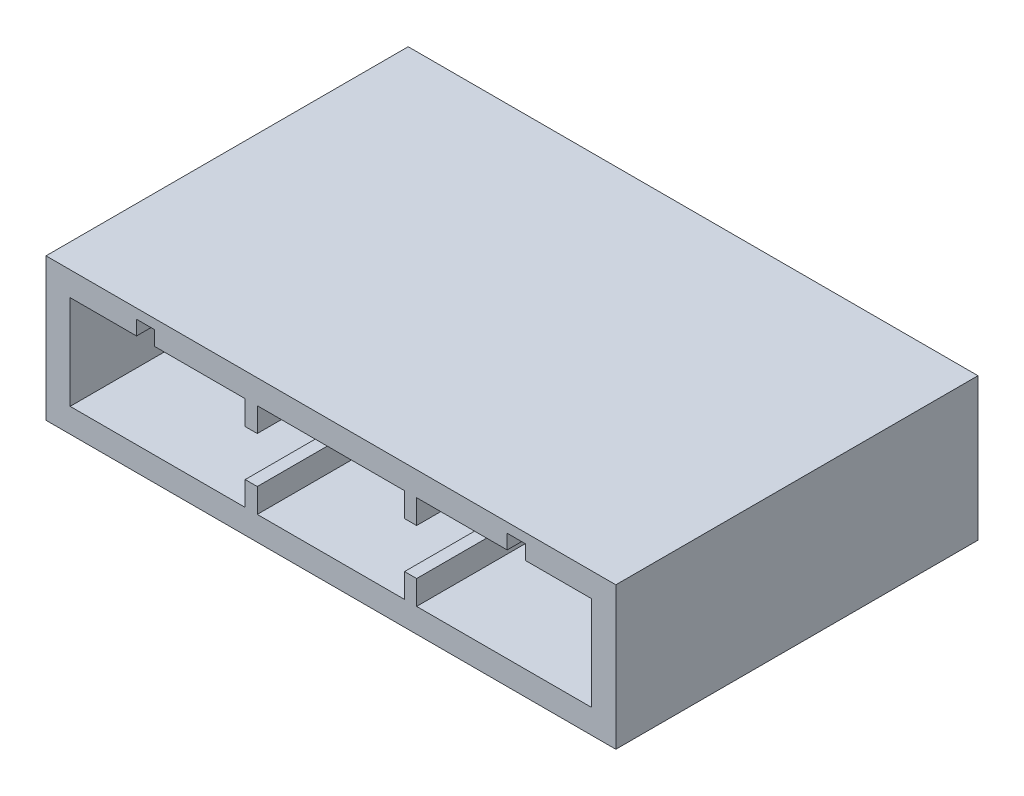
ISO-10303-21;
HEADER;
FILE_DESCRIPTION(('STEP AP214'),'2;1');
FILE_NAME('part.step','',(''),(''),'','','');
FILE_SCHEMA(('AUTOMOTIVE_DESIGN { 1 0 10303 214 1 1 1 1 }'));
ENDSEC;
DATA;
#1=APPLICATION_CONTEXT('core data for automotive mechanical design processes');
#2=APPLICATION_PROTOCOL_DEFINITION('international standard','automotive_design',2000,#1);
#3=PRODUCT_CONTEXT('',#1,'mechanical');
#4=PRODUCT('Part','Part','',(#3));
#5=PRODUCT_RELATED_PRODUCT_CATEGORY('part','',(#4));
#6=PRODUCT_DEFINITION_FORMATION('','',#4);
#7=PRODUCT_DEFINITION_CONTEXT('part definition',#1,'design');
#8=PRODUCT_DEFINITION('design','',#6,#7);
#9=PRODUCT_DEFINITION_SHAPE('','',#8);
#10=(LENGTH_UNIT() NAMED_UNIT(*) SI_UNIT(.MILLI.,.METRE.));
#11=(NAMED_UNIT(*) PLANE_ANGLE_UNIT() SI_UNIT($,.RADIAN.));
#12=(NAMED_UNIT(*) SI_UNIT($,.STERADIAN.) SOLID_ANGLE_UNIT());
#13=UNCERTAINTY_MEASURE_WITH_UNIT(LENGTH_MEASURE(1.E-05),#10,'distance_accuracy_value','');
#14=(GEOMETRIC_REPRESENTATION_CONTEXT(3) GLOBAL_UNCERTAINTY_ASSIGNED_CONTEXT((#13)) GLOBAL_UNIT_ASSIGNED_CONTEXT((#10,
#11,#12)) REPRESENTATION_CONTEXT('',''));
#15=CARTESIAN_POINT('',(0.,0.,0.));
#16=DIRECTION('',(0.,0.,1.));
#17=DIRECTION('',(1.,0.,0.));
#18=AXIS2_PLACEMENT_3D('',#15,#16,#17);
#19=CARTESIAN_POINT('',(-21.6,-12.860315389769,20.));
#20=DIRECTION('',(0.,1.,0.));
#21=DIRECTION('',(0.,0.,1.));
#22=AXIS2_PLACEMENT_3D('',#19,#20,#21);
#23=PLANE('',#22);
#24=DIRECTION('',(0.,0.,1.));
#25=VECTOR('',#24,1.);
#26=CARTESIAN_POINT('',(6.09999999999999,-12.860315389769,0.));
#27=LINE('',#26,#25);
#28=CARTESIAN_POINT('',(6.09999999999999,-12.860315389769,0.));
#29=VERTEX_POINT('',#28);
#30=CARTESIAN_POINT('',(6.09999999999999,-12.860315389769,20.));
#31=VERTEX_POINT('',#30);
#32=EDGE_CURVE('E256',#29,#31,#27,.T.);
#33=ORIENTED_EDGE('',*,*,#32,.F.);
#34=DIRECTION('',(1.,0.,0.));
#35=VECTOR('',#34,1.);
#36=CARTESIAN_POINT('',(-21.6,-12.860315389769,0.));
#37=LINE('',#36,#35);
#38=CARTESIAN_POINT('',(-6.1,-12.860315389769,0.));
#39=VERTEX_POINT('',#38);
#40=EDGE_CURVE('E317',#39,#29,#37,.T.);
#41=ORIENTED_EDGE('',*,*,#40,.F.);
#42=DIRECTION('',(0.,0.,1.));
#43=VECTOR('',#42,1.);
#44=CARTESIAN_POINT('',(-6.1,-12.860315389769,0.));
#45=LINE('',#44,#43);
#46=CARTESIAN_POINT('',(-6.1,-12.860315389769,20.));
#47=VERTEX_POINT('',#46);
#48=EDGE_CURVE('E69',#39,#47,#45,.T.);
#49=ORIENTED_EDGE('',*,*,#48,.T.);
#50=DIRECTION('',(1.,0.,0.));
#51=VECTOR('',#50,1.);
#52=CARTESIAN_POINT('',(-21.6,-12.860315389769,20.));
#53=LINE('',#52,#51);
#54=EDGE_CURVE('E276',#47,#31,#53,.T.);
#55=ORIENTED_EDGE('',*,*,#54,.T.);
#56=EDGE_LOOP('',(#33,#41,#49,#55));
#57=FACE_BOUND('',#56,.T.);
#58=ADVANCED_FACE('F45',(#57),#23,.T.);
#59=DIRECTION('',(0.,0.,1.));
#60=VECTOR('',#59,1.);
#61=CARTESIAN_POINT('',(-7.1,-12.860315389769,0.));
#62=LINE('',#61,#60);
#63=CARTESIAN_POINT('',(-7.1,-12.860315389769,0.));
#64=VERTEX_POINT('',#63);
#65=CARTESIAN_POINT('',(-7.1,-12.860315389769,20.));
#66=VERTEX_POINT('',#65);
#67=EDGE_CURVE('E635',#64,#66,#62,.T.);
#68=ORIENTED_EDGE('',*,*,#67,.F.);
#69=CARTESIAN_POINT('',(-21.6,-12.860315389769,0.));
#70=VERTEX_POINT('',#69);
#71=EDGE_CURVE('E312',#70,#64,#37,.T.);
#72=ORIENTED_EDGE('',*,*,#71,.F.);
#73=DIRECTION('',(0.,0.,-1.));
#74=VECTOR('',#73,1.);
#75=CARTESIAN_POINT('',(-21.6,-12.860315389769,20.));
#76=LINE('',#75,#74);
#77=CARTESIAN_POINT('',(-21.6,-12.860315389769,20.));
#78=VERTEX_POINT('',#77);
#79=EDGE_CURVE('E338',#78,#70,#76,.T.);
#80=ORIENTED_EDGE('',*,*,#79,.F.);
#81=EDGE_CURVE('E284',#78,#66,#53,.T.);
#82=ORIENTED_EDGE('',*,*,#81,.T.);
#83=EDGE_LOOP('',(#68,#72,#80,#82));
#84=FACE_BOUND('',#83,.T.);
#85=ADVANCED_FACE('F708',(#84),#23,.T.);
#86=CARTESIAN_POINT('',(-21.6,-5.06031538976903,20.));
#87=DIRECTION('',(0.,-1.,0.));
#88=DIRECTION('',(0.,0.,-1.));
#89=AXIS2_PLACEMENT_3D('',#86,#87,#88);
#90=PLANE('',#89);
#91=DIRECTION('',(0.,0.,1.));
#92=VECTOR('',#91,1.);
#93=CARTESIAN_POINT('',(7.1,-5.06031538976903,0.));
#94=LINE('',#93,#92);
#95=CARTESIAN_POINT('',(7.1,-5.06031538976903,0.));
#96=VERTEX_POINT('',#95);
#97=CARTESIAN_POINT('',(7.1,-5.06031538976903,20.));
#98=VERTEX_POINT('',#97);
#99=EDGE_CURVE('E530',#96,#98,#94,.T.);
#100=ORIENTED_EDGE('',*,*,#99,.F.);
#101=DIRECTION('',(-1.,0.,0.));
#102=VECTOR('',#101,1.);
#103=CARTESIAN_POINT('',(-21.6,-5.06031538976903,0.));
#104=LINE('',#103,#102);
#105=CARTESIAN_POINT('',(14.6,-5.06031538976903,0.));
#106=VERTEX_POINT('',#105);
#107=EDGE_CURVE('E326',#106,#96,#104,.T.);
#108=ORIENTED_EDGE('',*,*,#107,.F.);
#109=DIRECTION('',(0.,0.,1.));
#110=VECTOR('',#109,1.);
#111=CARTESIAN_POINT('',(14.6,-5.06031538976903,0.));
#112=LINE('',#111,#110);
#113=CARTESIAN_POINT('',(14.6,-5.06031538976903,20.));
#114=VERTEX_POINT('',#113);
#115=EDGE_CURVE('E380',#106,#114,#112,.T.);
#116=ORIENTED_EDGE('',*,*,#115,.T.);
#117=DIRECTION('',(-1.,0.,0.));
#118=VECTOR('',#117,1.);
#119=CARTESIAN_POINT('',(-21.6,-5.06031538976903,20.));
#120=LINE('',#119,#118);
#121=EDGE_CURVE('E304',#114,#98,#120,.T.);
#122=ORIENTED_EDGE('',*,*,#121,.T.);
#123=EDGE_LOOP('',(#100,#108,#116,#122));
#124=FACE_BOUND('',#123,.T.);
#125=ADVANCED_FACE('F529',(#124),#90,.T.);
#126=DIRECTION('',(0.,0.,1.));
#127=VECTOR('',#126,1.);
#128=CARTESIAN_POINT('',(6.1,-5.06031538976903,0.));
#129=LINE('',#128,#127);
#130=CARTESIAN_POINT('',(6.1,-5.06031538976903,0.));
#131=VERTEX_POINT('',#130);
#132=CARTESIAN_POINT('',(6.1,-5.06031538976903,20.));
#133=VERTEX_POINT('',#132);
#134=EDGE_CURVE('E557',#131,#133,#129,.T.);
#135=ORIENTED_EDGE('',*,*,#134,.T.);
#136=CARTESIAN_POINT('',(-6.1,-5.06031538976903,20.));
#137=VERTEX_POINT('',#136);
#138=EDGE_CURVE('E305',#133,#137,#120,.T.);
#139=ORIENTED_EDGE('',*,*,#138,.T.);
#140=DIRECTION('',(0.,0.,1.));
#141=VECTOR('',#140,1.);
#142=CARTESIAN_POINT('',(-6.1,-5.06031538976903,0.));
#143=LINE('',#142,#141);
#144=CARTESIAN_POINT('',(-6.1,-5.06031538976903,0.));
#145=VERTEX_POINT('',#144);
#146=EDGE_CURVE('E387',#145,#137,#143,.T.);
#147=ORIENTED_EDGE('',*,*,#146,.F.);
#148=EDGE_CURVE('E327',#131,#145,#104,.T.);
#149=ORIENTED_EDGE('',*,*,#148,.F.);
#150=EDGE_LOOP('',(#135,#139,#147,#149));
#151=FACE_BOUND('',#150,.T.);
#152=ADVANCED_FACE('F599',(#151),#90,.T.);
#153=DIRECTION('',(0.,0.,1.));
#154=VECTOR('',#153,1.);
#155=CARTESIAN_POINT('',(-16.1,-5.06031538976903,0.));
#156=LINE('',#155,#154);
#157=CARTESIAN_POINT('',(-16.1,-5.06031538976903,0.));
#158=VERTEX_POINT('',#157);
#159=CARTESIAN_POINT('',(-16.1,-5.06031538976903,20.));
#160=VERTEX_POINT('',#159);
#161=EDGE_CURVE('E311',#158,#160,#156,.T.);
#162=ORIENTED_EDGE('',*,*,#161,.T.);
#163=CARTESIAN_POINT('',(-21.6,-5.06031538976903,20.));
#164=VERTEX_POINT('',#163);
#165=EDGE_CURVE('E298',#160,#164,#120,.T.);
#166=ORIENTED_EDGE('',*,*,#165,.T.);
#167=DIRECTION('',(0.,0.,-1.));
#168=VECTOR('',#167,1.);
#169=CARTESIAN_POINT('',(-21.6,-5.06031538976903,20.));
#170=LINE('',#169,#168);
#171=CARTESIAN_POINT('',(-21.6,-5.06031538976903,0.));
#172=VERTEX_POINT('',#171);
#173=EDGE_CURVE('E303',#164,#172,#170,.T.);
#174=ORIENTED_EDGE('',*,*,#173,.T.);
#175=EDGE_CURVE('E321',#158,#172,#104,.T.);
#176=ORIENTED_EDGE('',*,*,#175,.F.);
#177=EDGE_LOOP('',(#162,#166,#174,#176));
#178=FACE_BOUND('',#177,.T.);
#179=ADVANCED_FACE('F748',(#178),#90,.T.);
#180=DIRECTION('',(0.,0.,1.));
#181=VECTOR('',#180,1.);
#182=CARTESIAN_POINT('',(-7.1,-5.06031538976903,0.));
#183=LINE('',#182,#181);
#184=CARTESIAN_POINT('',(-7.1,-5.06031538976903,0.));
#185=VERTEX_POINT('',#184);
#186=CARTESIAN_POINT('',(-7.1,-5.06031538976903,20.));
#187=VERTEX_POINT('',#186);
#188=EDGE_CURVE('E396',#185,#187,#183,.T.);
#189=ORIENTED_EDGE('',*,*,#188,.T.);
#190=CARTESIAN_POINT('',(-14.6,-5.06031538976903,20.));
#191=VERTEX_POINT('',#190);
#192=EDGE_CURVE('E520',#187,#191,#120,.T.);
#193=ORIENTED_EDGE('',*,*,#192,.T.);
#194=DIRECTION('',(0.,0.,1.));
#195=VECTOR('',#194,1.);
#196=CARTESIAN_POINT('',(-14.6,-5.06031538976903,0.));
#197=LINE('',#196,#195);
#198=CARTESIAN_POINT('',(-14.6,-5.06031538976903,0.));
#199=VERTEX_POINT('',#198);
#200=EDGE_CURVE('E414',#199,#191,#197,.T.);
#201=ORIENTED_EDGE('',*,*,#200,.F.);
#202=EDGE_CURVE('E500',#185,#199,#104,.T.);
#203=ORIENTED_EDGE('',*,*,#202,.F.);
#204=EDGE_LOOP('',(#189,#193,#201,#203));
#205=FACE_BOUND('',#204,.T.);
#206=ADVANCED_FACE('F518',(#205),#90,.T.);
#207=CARTESIAN_POINT('',(0.,0.,20.));
#208=DIRECTION('',(0.,0.,-1.));
#209=DIRECTION('',(-1.,0.,0.));
#210=AXIS2_PLACEMENT_3D('',#207,#208,#209);
#211=PLANE('',#210);
#212=DIRECTION('',(0.,1.,0.));
#213=VECTOR('',#212,1.);
#214=CARTESIAN_POINT('',(23.6,-14.860315389769,20.));
#215=LINE('',#214,#213);
#216=CARTESIAN_POINT('',(23.6,-14.860315389769,20.));
#217=VERTEX_POINT('',#216);
#218=CARTESIAN_POINT('',(23.6,-3.06031538976903,20.));
#219=VERTEX_POINT('',#218);
#220=EDGE_CURVE('E342',#217,#219,#215,.T.);
#221=ORIENTED_EDGE('',*,*,#220,.T.);
#222=DIRECTION('',(-1.,0.,0.));
#223=VECTOR('',#222,1.);
#224=CARTESIAN_POINT('',(-23.6,-3.06031538976903,20.));
#225=LINE('',#224,#223);
#226=CARTESIAN_POINT('',(-23.6,-3.06031538976903,20.));
#227=VERTEX_POINT('',#226);
#228=EDGE_CURVE('E346',#219,#227,#225,.T.);
#229=ORIENTED_EDGE('',*,*,#228,.T.);
#230=DIRECTION('',(0.,-1.,0.));
#231=VECTOR('',#230,1.);
#232=CARTESIAN_POINT('',(-23.6,-14.860315389769,20.));
#233=LINE('',#232,#231);
#234=CARTESIAN_POINT('',(-23.6,-14.860315389769,20.));
#235=VERTEX_POINT('',#234);
#236=EDGE_CURVE('E349',#227,#235,#233,.T.);
#237=ORIENTED_EDGE('',*,*,#236,.T.);
#238=DIRECTION('',(1.,0.,0.));
#239=VECTOR('',#238,1.);
#240=CARTESIAN_POINT('',(-23.6,-14.860315389769,20.));
#241=LINE('',#240,#239);
#242=EDGE_CURVE('E352',#235,#217,#241,.T.);
#243=ORIENTED_EDGE('',*,*,#242,.T.);
#244=EDGE_LOOP('',(#221,#229,#237,#243));
#245=FACE_BOUND('',#244,.T.);
#246=ORIENTED_EDGE('',*,*,#165,.F.);
#247=DIRECTION('',(0.,-1.,0.));
#248=VECTOR('',#247,1.);
#249=CARTESIAN_POINT('',(-16.1,-5.06031538976903,20.));
#250=LINE('',#249,#248);
#251=CARTESIAN_POINT('',(-16.1,-3.86031538976903,20.));
#252=VERTEX_POINT('',#251);
#253=EDGE_CURVE('E406',#252,#160,#250,.T.);
#254=ORIENTED_EDGE('',*,*,#253,.F.);
#255=DIRECTION('',(-1.,0.,0.));
#256=VECTOR('',#255,1.);
#257=CARTESIAN_POINT('',(-16.1,-3.86031538976903,20.));
#258=LINE('',#257,#256);
#259=CARTESIAN_POINT('',(-14.6,-3.86031538976903,20.));
#260=VERTEX_POINT('',#259);
#261=EDGE_CURVE('E419',#260,#252,#258,.T.);
#262=ORIENTED_EDGE('',*,*,#261,.F.);
#263=DIRECTION('',(0.,1.,0.));
#264=VECTOR('',#263,1.);
#265=CARTESIAN_POINT('',(-14.6,-3.86031538976903,20.));
#266=LINE('',#265,#264);
#267=EDGE_CURVE('E415',#191,#260,#266,.T.);
#268=ORIENTED_EDGE('',*,*,#267,.F.);
#269=ORIENTED_EDGE('',*,*,#192,.F.);
#270=DIRECTION('',(0.,-1.,0.));
#271=VECTOR('',#270,1.);
#272=CARTESIAN_POINT('',(-7.1,-5.06031538976903,20.));
#273=LINE('',#272,#271);
#274=CARTESIAN_POINT('',(-7.1,-7.06031538976903,20.));
#275=VERTEX_POINT('',#274);
#276=EDGE_CURVE('E554',#187,#275,#273,.T.);
#277=ORIENTED_EDGE('',*,*,#276,.T.);
#278=DIRECTION('',(1.,0.,0.));
#279=VECTOR('',#278,1.);
#280=CARTESIAN_POINT('',(-7.1,-7.06031538976903,20.));
#281=LINE('',#280,#279);
#282=CARTESIAN_POINT('',(-6.1,-7.06031538976903,20.));
#283=VERTEX_POINT('',#282);
#284=EDGE_CURVE('E574',#275,#283,#281,.T.);
#285=ORIENTED_EDGE('',*,*,#284,.T.);
#286=DIRECTION('',(0.,1.,0.));
#287=VECTOR('',#286,1.);
#288=CARTESIAN_POINT('',(-6.1,-7.06031538976903,20.));
#289=LINE('',#288,#287);
#290=EDGE_CURVE('E564',#283,#137,#289,.T.);
#291=ORIENTED_EDGE('',*,*,#290,.T.);
#292=ORIENTED_EDGE('',*,*,#138,.F.);
#293=DIRECTION('',(0.,-1.,0.));
#294=VECTOR('',#293,1.);
#295=CARTESIAN_POINT('',(6.1,-7.06031538976903,20.));
#296=LINE('',#295,#294);
#297=CARTESIAN_POINT('',(6.1,-7.06031538976903,20.));
#298=VERTEX_POINT('',#297);
#299=EDGE_CURVE('E544',#133,#298,#296,.T.);
#300=ORIENTED_EDGE('',*,*,#299,.T.);
#301=DIRECTION('',(1.,0.,0.));
#302=VECTOR('',#301,1.);
#303=CARTESIAN_POINT('',(7.1,-7.06031538976903,20.));
#304=LINE('',#303,#302);
#305=CARTESIAN_POINT('',(7.1,-7.06031538976903,20.));
#306=VERTEX_POINT('',#305);
#307=EDGE_CURVE('E537',#298,#306,#304,.T.);
#308=ORIENTED_EDGE('',*,*,#307,.T.);
#309=DIRECTION('',(0.,1.,0.));
#310=VECTOR('',#309,1.);
#311=CARTESIAN_POINT('',(7.1,-5.06031538976903,20.));
#312=LINE('',#311,#310);
#313=EDGE_CURVE('E534',#306,#98,#312,.T.);
#314=ORIENTED_EDGE('',*,*,#313,.T.);
#315=ORIENTED_EDGE('',*,*,#121,.F.);
#316=DIRECTION('',(0.,-1.,0.));
#317=VECTOR('',#316,1.);
#318=CARTESIAN_POINT('',(14.6,-3.86031538976903,20.));
#319=LINE('',#318,#317);
#320=CARTESIAN_POINT('',(14.6,-3.86031538976903,20.));
#321=VERTEX_POINT('',#320);
#322=EDGE_CURVE('E451',#321,#114,#319,.T.);
#323=ORIENTED_EDGE('',*,*,#322,.F.);
#324=DIRECTION('',(-1.,0.,0.));
#325=VECTOR('',#324,1.);
#326=CARTESIAN_POINT('',(16.1,-3.86031538976903,20.));
#327=LINE('',#326,#325);
#328=CARTESIAN_POINT('',(16.1,-3.86031538976903,20.));
#329=VERTEX_POINT('',#328);
#330=EDGE_CURVE('E454',#329,#321,#327,.T.);
#331=ORIENTED_EDGE('',*,*,#330,.F.);
#332=DIRECTION('',(0.,1.,0.));
#333=VECTOR('',#332,1.);
#334=CARTESIAN_POINT('',(16.1,-5.06031538976903,20.));
#335=LINE('',#334,#333);
#336=CARTESIAN_POINT('',(16.1,-5.06031538976903,20.));
#337=VERTEX_POINT('',#336);
#338=EDGE_CURVE('E420',#337,#329,#335,.T.);
#339=ORIENTED_EDGE('',*,*,#338,.F.);
#340=CARTESIAN_POINT('',(21.6,-5.06031538976903,20.));
#341=VERTEX_POINT('',#340);
#342=EDGE_CURVE('E299',#341,#337,#120,.T.);
#343=ORIENTED_EDGE('',*,*,#342,.F.);
#344=DIRECTION('',(0.,1.,0.));
#345=VECTOR('',#344,1.);
#346=CARTESIAN_POINT('',(21.6,-5.06031538976903,20.));
#347=LINE('',#346,#345);
#348=CARTESIAN_POINT('',(21.6,-12.860315389769,20.));
#349=VERTEX_POINT('',#348);
#350=EDGE_CURVE('E290',#349,#341,#347,.T.);
#351=ORIENTED_EDGE('',*,*,#350,.F.);
#352=CARTESIAN_POINT('',(7.09999999999999,-12.860315389769,20.));
#353=VERTEX_POINT('',#352);
#354=EDGE_CURVE('E285',#353,#349,#53,.T.);
#355=ORIENTED_EDGE('',*,*,#354,.F.);
#356=DIRECTION('',(0.,1.,0.));
#357=VECTOR('',#356,1.);
#358=CARTESIAN_POINT('',(7.1,-10.860315389769,20.));
#359=LINE('',#358,#357);
#360=CARTESIAN_POINT('',(7.1,-10.860315389769,20.));
#361=VERTEX_POINT('',#360);
#362=EDGE_CURVE('E639',#353,#361,#359,.T.);
#363=ORIENTED_EDGE('',*,*,#362,.T.);
#364=DIRECTION('',(-1.,0.,0.));
#365=VECTOR('',#364,1.);
#366=CARTESIAN_POINT('',(6.1,-10.860315389769,20.));
#367=LINE('',#366,#365);
#368=CARTESIAN_POINT('',(6.1,-10.860315389769,20.));
#369=VERTEX_POINT('',#368);
#370=EDGE_CURVE('E279',#361,#369,#367,.T.);
#371=ORIENTED_EDGE('',*,*,#370,.T.);
#372=DIRECTION('',(0.,-1.,0.));
#373=VECTOR('',#372,1.);
#374=CARTESIAN_POINT('',(6.09999999999999,-12.860315389769,20.));
#375=LINE('',#374,#373);
#376=EDGE_CURVE('E259',#369,#31,#375,.T.);
#377=ORIENTED_EDGE('',*,*,#376,.T.);
#378=ORIENTED_EDGE('',*,*,#54,.F.);
#379=DIRECTION('',(0.,1.,0.));
#380=VECTOR('',#379,1.);
#381=CARTESIAN_POINT('',(-6.1,-10.860315389769,20.));
#382=LINE('',#381,#380);
#383=CARTESIAN_POINT('',(-6.1,-10.860315389769,20.));
#384=VERTEX_POINT('',#383);
#385=EDGE_CURVE('E611',#47,#384,#382,.T.);
#386=ORIENTED_EDGE('',*,*,#385,.T.);
#387=DIRECTION('',(-1.,0.,0.));
#388=VECTOR('',#387,1.);
#389=CARTESIAN_POINT('',(-7.1,-10.860315389769,20.));
#390=LINE('',#389,#388);
#391=CARTESIAN_POINT('',(-7.1,-10.860315389769,20.));
#392=VERTEX_POINT('',#391);
#393=EDGE_CURVE('E628',#384,#392,#390,.T.);
#394=ORIENTED_EDGE('',*,*,#393,.T.);
#395=DIRECTION('',(0.,-1.,0.));
#396=VECTOR('',#395,1.);
#397=CARTESIAN_POINT('',(-7.1,-12.860315389769,20.));
#398=LINE('',#397,#396);
#399=EDGE_CURVE('E618',#392,#66,#398,.T.);
#400=ORIENTED_EDGE('',*,*,#399,.T.);
#401=ORIENTED_EDGE('',*,*,#81,.F.);
#402=DIRECTION('',(0.,-1.,0.));
#403=VECTOR('',#402,1.);
#404=CARTESIAN_POINT('',(-21.6,-5.06031538976903,20.));
#405=LINE('',#404,#403);
#406=EDGE_CURVE('E291',#164,#78,#405,.T.);
#407=ORIENTED_EDGE('',*,*,#406,.F.);
#408=EDGE_LOOP('',(#246,#254,#262,#268,#269,#277,#285,#291,#292,#300,#308,#314,#315,#323,#331,
#339,#343,#351,#355,#363,#371,#377,#378,#386,#394,#400,#401,#407));
#409=FACE_BOUND('',#408,.T.);
#410=ADVANCED_FACE('F274',(#245,#409),#211,.F.);
#411=CARTESIAN_POINT('',(23.6,-14.860315389769,20.));
#412=DIRECTION('',(-1.,0.,0.));
#413=DIRECTION('',(0.,0.,1.));
#414=AXIS2_PLACEMENT_3D('',#411,#412,#413);
#415=PLANE('',#414);
#416=DIRECTION('',(0.,0.,-1.));
#417=VECTOR('',#416,1.);
#418=CARTESIAN_POINT('',(23.6,-14.860315389769,20.));
#419=LINE('',#418,#417);
#420=CARTESIAN_POINT('',(23.6,-14.860315389769,-10.));
#421=VERTEX_POINT('',#420);
#422=EDGE_CURVE('E355',#217,#421,#419,.T.);
#423=ORIENTED_EDGE('',*,*,#422,.T.);
#424=DIRECTION('',(0.,-1.,0.));
#425=VECTOR('',#424,1.);
#426=CARTESIAN_POINT('',(23.6,-3.06031538976903,-10.));
#427=LINE('',#426,#425);
#428=CARTESIAN_POINT('',(23.6,-3.06031538976903,-10.));
#429=VERTEX_POINT('',#428);
#430=EDGE_CURVE('E386',#429,#421,#427,.T.);
#431=ORIENTED_EDGE('',*,*,#430,.F.);
#432=DIRECTION('',(0.,0.,-1.));
#433=VECTOR('',#432,1.);
#434=CARTESIAN_POINT('',(23.6,-3.06031538976903,20.));
#435=LINE('',#434,#433);
#436=EDGE_CURVE('E11',#219,#429,#435,.T.);
#437=ORIENTED_EDGE('',*,*,#436,.F.);
#438=ORIENTED_EDGE('',*,*,#220,.F.);
#439=EDGE_LOOP('',(#423,#431,#437,#438));
#440=FACE_BOUND('',#439,.T.);
#441=ADVANCED_FACE('F47',(#440),#415,.F.);
#442=CARTESIAN_POINT('',(-23.6,-3.06031538976903,20.));
#443=DIRECTION('',(0.,-1.,0.));
#444=DIRECTION('',(0.,0.,-1.));
#445=AXIS2_PLACEMENT_3D('',#442,#443,#444);
#446=PLANE('',#445);
#447=ORIENTED_EDGE('',*,*,#436,.T.);
#448=DIRECTION('',(1.,0.,0.));
#449=VECTOR('',#448,1.);
#450=CARTESIAN_POINT('',(-23.6,-3.06031538976903,-10.));
#451=LINE('',#450,#449);
#452=CARTESIAN_POINT('',(-23.6,-3.06031538976903,-10.));
#453=VERTEX_POINT('',#452);
#454=EDGE_CURVE('E376',#453,#429,#451,.T.);
#455=ORIENTED_EDGE('',*,*,#454,.F.);
#456=DIRECTION('',(0.,0.,-1.));
#457=VECTOR('',#456,1.);
#458=CARTESIAN_POINT('',(-23.6,-3.06031538976903,20.));
#459=LINE('',#458,#457);
#460=EDGE_CURVE('E54',#227,#453,#459,.T.);
#461=ORIENTED_EDGE('',*,*,#460,.F.);
#462=ORIENTED_EDGE('',*,*,#228,.F.);
#463=EDGE_LOOP('',(#447,#455,#461,#462));
#464=FACE_BOUND('',#463,.T.);
#465=ADVANCED_FACE('F382',(#464),#446,.F.);
#466=CARTESIAN_POINT('',(-23.6,-14.860315389769,20.));
#467=DIRECTION('',(1.,0.,0.));
#468=DIRECTION('',(0.,0.,-1.));
#469=AXIS2_PLACEMENT_3D('',#466,#467,#468);
#470=PLANE('',#469);
#471=ORIENTED_EDGE('',*,*,#460,.T.);
#472=DIRECTION('',(0.,1.,0.));
#473=VECTOR('',#472,1.);
#474=CARTESIAN_POINT('',(-23.6,-14.860315389769,-10.));
#475=LINE('',#474,#473);
#476=CARTESIAN_POINT('',(-23.6,-14.860315389769,-10.));
#477=VERTEX_POINT('',#476);
#478=EDGE_CURVE('E368',#477,#453,#475,.T.);
#479=ORIENTED_EDGE('',*,*,#478,.F.);
#480=DIRECTION('',(0.,0.,-1.));
#481=VECTOR('',#480,1.);
#482=CARTESIAN_POINT('',(-23.6,-14.860315389769,20.));
#483=LINE('',#482,#481);
#484=EDGE_CURVE('E358',#235,#477,#483,.T.);
#485=ORIENTED_EDGE('',*,*,#484,.F.);
#486=ORIENTED_EDGE('',*,*,#236,.F.);
#487=EDGE_LOOP('',(#471,#479,#485,#486));
#488=FACE_BOUND('',#487,.T.);
#489=ADVANCED_FACE('F366',(#488),#470,.F.);
#490=CARTESIAN_POINT('',(-23.6,-14.860315389769,20.));
#491=DIRECTION('',(0.,1.,0.));
#492=DIRECTION('',(0.,0.,1.));
#493=AXIS2_PLACEMENT_3D('',#490,#491,#492);
#494=PLANE('',#493);
#495=ORIENTED_EDGE('',*,*,#484,.T.);
#496=DIRECTION('',(-1.,0.,0.));
#497=VECTOR('',#496,1.);
#498=CARTESIAN_POINT('',(23.6,-14.860315389769,-10.));
#499=LINE('',#498,#497);
#500=EDGE_CURVE('E378',#421,#477,#499,.T.);
#501=ORIENTED_EDGE('',*,*,#500,.F.);
#502=ORIENTED_EDGE('',*,*,#422,.F.);
#503=ORIENTED_EDGE('',*,*,#242,.F.);
#504=EDGE_LOOP('',(#495,#501,#502,#503));
#505=FACE_BOUND('',#504,.T.);
#506=ADVANCED_FACE('F726',(#505),#494,.F.);
#507=CARTESIAN_POINT('',(-21.6,-5.06031538976903,20.));
#508=DIRECTION('',(1.,0.,0.));
#509=DIRECTION('',(0.,1.,0.));
#510=AXIS2_PLACEMENT_3D('',#507,#508,#509);
#511=PLANE('',#510);
#512=DIRECTION('',(0.,-1.,0.));
#513=VECTOR('',#512,1.);
#514=CARTESIAN_POINT('',(-21.6,-5.06031538976903,0.));
#515=LINE('',#514,#513);
#516=EDGE_CURVE('E306',#172,#70,#515,.T.);
#517=ORIENTED_EDGE('',*,*,#516,.F.);
#518=ORIENTED_EDGE('',*,*,#173,.F.);
#519=ORIENTED_EDGE('',*,*,#406,.T.);
#520=ORIENTED_EDGE('',*,*,#79,.T.);
#521=EDGE_LOOP('',(#517,#518,#519,#520));
#522=FACE_BOUND('',#521,.T.);
#523=ADVANCED_FACE('F719',(#522),#511,.T.);
#524=DIRECTION('',(0.,0.,1.));
#525=VECTOR('',#524,1.);
#526=CARTESIAN_POINT('',(7.09999999999999,-12.860315389769,0.));
#527=LINE('',#526,#525);
#528=CARTESIAN_POINT('',(7.09999999999999,-12.860315389769,0.));
#529=VERTEX_POINT('',#528);
#530=EDGE_CURVE('E61',#529,#353,#527,.T.);
#531=ORIENTED_EDGE('',*,*,#530,.T.);
#532=ORIENTED_EDGE('',*,*,#354,.T.);
#533=DIRECTION('',(0.,0.,-1.));
#534=VECTOR('',#533,1.);
#535=CARTESIAN_POINT('',(21.6,-12.860315389769,20.));
#536=LINE('',#535,#534);
#537=CARTESIAN_POINT('',(21.6,-12.860315389769,0.));
#538=VERTEX_POINT('',#537);
#539=EDGE_CURVE('E334',#349,#538,#536,.T.);
#540=ORIENTED_EDGE('',*,*,#539,.T.);
#541=EDGE_CURVE('E310',#529,#538,#37,.T.);
#542=ORIENTED_EDGE('',*,*,#541,.F.);
#543=EDGE_LOOP('',(#531,#532,#540,#542));
#544=FACE_BOUND('',#543,.T.);
#545=ADVANCED_FACE('F710',(#544),#23,.T.);
#546=CARTESIAN_POINT('',(21.6,-5.06031538976903,20.));
#547=DIRECTION('',(-1.,0.,0.));
#548=DIRECTION('',(0.,-1.,0.));
#549=AXIS2_PLACEMENT_3D('',#546,#547,#548);
#550=PLANE('',#549);
#551=DIRECTION('',(0.,1.,0.));
#552=VECTOR('',#551,1.);
#553=CARTESIAN_POINT('',(21.6,-5.06031538976903,0.));
#554=LINE('',#553,#552);
#555=CARTESIAN_POINT('',(21.6,-5.06031538976903,0.));
#556=VERTEX_POINT('',#555);
#557=EDGE_CURVE('E316',#538,#556,#554,.T.);
#558=ORIENTED_EDGE('',*,*,#557,.F.);
#559=ORIENTED_EDGE('',*,*,#539,.F.);
#560=ORIENTED_EDGE('',*,*,#350,.T.);
#561=DIRECTION('',(0.,0.,-1.));
#562=VECTOR('',#561,1.);
#563=CARTESIAN_POINT('',(21.6,-5.06031538976903,20.));
#564=LINE('',#563,#562);
#565=EDGE_CURVE('E331',#341,#556,#564,.T.);
#566=ORIENTED_EDGE('',*,*,#565,.T.);
#567=EDGE_LOOP('',(#558,#559,#560,#566));
#568=FACE_BOUND('',#567,.T.);
#569=ADVANCED_FACE('F718',(#568),#550,.T.);
#570=DIRECTION('',(0.,0.,1.));
#571=VECTOR('',#570,1.);
#572=CARTESIAN_POINT('',(16.1,-5.06031538976903,0.));
#573=LINE('',#572,#571);
#574=CARTESIAN_POINT('',(16.1,-5.06031538976903,0.));
#575=VERTEX_POINT('',#574);
#576=EDGE_CURVE('E438',#575,#337,#573,.T.);
#577=ORIENTED_EDGE('',*,*,#576,.F.);
#578=EDGE_CURVE('E322',#556,#575,#104,.T.);
#579=ORIENTED_EDGE('',*,*,#578,.F.);
#580=ORIENTED_EDGE('',*,*,#565,.F.);
#581=ORIENTED_EDGE('',*,*,#342,.T.);
#582=EDGE_LOOP('',(#577,#579,#580,#581));
#583=FACE_BOUND('',#582,.T.);
#584=ADVANCED_FACE('F479',(#583),#90,.T.);
#585=CARTESIAN_POINT('',(14.6,-3.86031538976903,0.));
#586=DIRECTION('',(-1.,0.,0.));
#587=DIRECTION('',(0.,0.,1.));
#588=AXIS2_PLACEMENT_3D('',#585,#586,#587);
#589=PLANE('',#588);
#590=ORIENTED_EDGE('',*,*,#322,.T.);
#591=ORIENTED_EDGE('',*,*,#115,.F.);
#592=DIRECTION('',(0.,-1.,0.));
#593=VECTOR('',#592,1.);
#594=CARTESIAN_POINT('',(14.6,-3.86031538976903,0.));
#595=LINE('',#594,#593);
#596=CARTESIAN_POINT('',(14.6,-3.86031538976903,0.));
#597=VERTEX_POINT('',#596);
#598=EDGE_CURVE('E441',#597,#106,#595,.T.);
#599=ORIENTED_EDGE('',*,*,#598,.F.);
#600=DIRECTION('',(0.,0.,1.));
#601=VECTOR('',#600,1.);
#602=CARTESIAN_POINT('',(14.6,-3.86031538976903,0.));
#603=LINE('',#602,#601);
#604=EDGE_CURVE('E445',#597,#321,#603,.T.);
#605=ORIENTED_EDGE('',*,*,#604,.T.);
#606=EDGE_LOOP('',(#590,#591,#599,#605));
#607=FACE_BOUND('',#606,.T.);
#608=ADVANCED_FACE('F490',(#607),#589,.F.);
#609=CARTESIAN_POINT('',(16.1,-3.86031538976903,0.));
#610=DIRECTION('',(0.,1.,0.));
#611=DIRECTION('',(-1.,0.,0.));
#612=AXIS2_PLACEMENT_3D('',#609,#610,#611);
#613=PLANE('',#612);
#614=ORIENTED_EDGE('',*,*,#330,.T.);
#615=ORIENTED_EDGE('',*,*,#604,.F.);
#616=DIRECTION('',(-1.,0.,0.));
#617=VECTOR('',#616,1.);
#618=CARTESIAN_POINT('',(16.1,-3.86031538976903,0.));
#619=LINE('',#618,#617);
#620=CARTESIAN_POINT('',(16.1,-3.86031538976903,0.));
#621=VERTEX_POINT('',#620);
#622=EDGE_CURVE('E465',#621,#597,#619,.T.);
#623=ORIENTED_EDGE('',*,*,#622,.F.);
#624=DIRECTION('',(0.,0.,1.));
#625=VECTOR('',#624,1.);
#626=CARTESIAN_POINT('',(16.1,-3.86031538976903,0.));
#627=LINE('',#626,#625);
#628=EDGE_CURVE('E442',#621,#329,#627,.T.);
#629=ORIENTED_EDGE('',*,*,#628,.T.);
#630=EDGE_LOOP('',(#614,#615,#623,#629));
#631=FACE_BOUND('',#630,.T.);
#632=ADVANCED_FACE('F487',(#631),#613,.F.);
#633=CARTESIAN_POINT('',(16.1,-5.06031538976903,0.));
#634=DIRECTION('',(1.,0.,0.));
#635=DIRECTION('',(0.,0.,-1.));
#636=AXIS2_PLACEMENT_3D('',#633,#634,#635);
#637=PLANE('',#636);
#638=ORIENTED_EDGE('',*,*,#338,.T.);
#639=ORIENTED_EDGE('',*,*,#628,.F.);
#640=DIRECTION('',(0.,1.,0.));
#641=VECTOR('',#640,1.);
#642=CARTESIAN_POINT('',(16.1,-5.06031538976903,0.));
#643=LINE('',#642,#641);
#644=EDGE_CURVE('E455',#575,#621,#643,.T.);
#645=ORIENTED_EDGE('',*,*,#644,.F.);
#646=ORIENTED_EDGE('',*,*,#576,.T.);
#647=EDGE_LOOP('',(#638,#639,#645,#646));
#648=FACE_BOUND('',#647,.T.);
#649=ADVANCED_FACE('F476',(#648),#637,.F.);
#650=CARTESIAN_POINT('',(-16.1,-5.06031538976903,0.));
#651=DIRECTION('',(-1.,0.,0.));
#652=DIRECTION('',(0.,0.,1.));
#653=AXIS2_PLACEMENT_3D('',#650,#651,#652);
#654=PLANE('',#653);
#655=ORIENTED_EDGE('',*,*,#253,.T.);
#656=ORIENTED_EDGE('',*,*,#161,.F.);
#657=DIRECTION('',(0.,-1.,0.));
#658=VECTOR('',#657,1.);
#659=CARTESIAN_POINT('',(-16.1,-5.06031538976903,0.));
#660=LINE('',#659,#658);
#661=CARTESIAN_POINT('',(-16.1,-3.86031538976903,0.));
#662=VERTEX_POINT('',#661);
#663=EDGE_CURVE('E410',#662,#158,#660,.T.);
#664=ORIENTED_EDGE('',*,*,#663,.F.);
#665=DIRECTION('',(0.,0.,1.));
#666=VECTOR('',#665,1.);
#667=CARTESIAN_POINT('',(-16.1,-3.86031538976903,0.));
#668=LINE('',#667,#666);
#669=EDGE_CURVE('E429',#662,#252,#668,.T.);
#670=ORIENTED_EDGE('',*,*,#669,.T.);
#671=EDGE_LOOP('',(#655,#656,#664,#670));
#672=FACE_BOUND('',#671,.T.);
#673=ADVANCED_FACE('F751',(#672),#654,.F.);
#674=CARTESIAN_POINT('',(-16.1,-3.86031538976903,0.));
#675=DIRECTION('',(0.,1.,0.));
#676=DIRECTION('',(0.,0.,1.));
#677=AXIS2_PLACEMENT_3D('',#674,#675,#676);
#678=PLANE('',#677);
#679=ORIENTED_EDGE('',*,*,#261,.T.);
#680=ORIENTED_EDGE('',*,*,#669,.F.);
#681=DIRECTION('',(-1.,0.,0.));
#682=VECTOR('',#681,1.);
#683=CARTESIAN_POINT('',(-16.1,-3.86031538976903,0.));
#684=LINE('',#683,#682);
#685=CARTESIAN_POINT('',(-14.6,-3.86031538976903,0.));
#686=VERTEX_POINT('',#685);
#687=EDGE_CURVE('E405',#686,#662,#684,.T.);
#688=ORIENTED_EDGE('',*,*,#687,.F.);
#689=DIRECTION('',(0.,0.,1.));
#690=VECTOR('',#689,1.);
#691=CARTESIAN_POINT('',(-14.6,-3.86031538976903,0.));
#692=LINE('',#691,#690);
#693=EDGE_CURVE('E432',#686,#260,#692,.T.);
#694=ORIENTED_EDGE('',*,*,#693,.T.);
#695=EDGE_LOOP('',(#679,#680,#688,#694));
#696=FACE_BOUND('',#695,.T.);
#697=ADVANCED_FACE('F753',(#696),#678,.F.);
#698=CARTESIAN_POINT('',(-14.6,-3.86031538976903,0.));
#699=DIRECTION('',(1.,0.,0.));
#700=DIRECTION('',(0.,1.,0.));
#701=AXIS2_PLACEMENT_3D('',#698,#699,#700);
#702=PLANE('',#701);
#703=ORIENTED_EDGE('',*,*,#267,.T.);
#704=ORIENTED_EDGE('',*,*,#693,.F.);
#705=DIRECTION('',(0.,1.,0.));
#706=VECTOR('',#705,1.);
#707=CARTESIAN_POINT('',(-14.6,-3.86031538976903,0.));
#708=LINE('',#707,#706);
#709=EDGE_CURVE('E401',#199,#686,#708,.T.);
#710=ORIENTED_EDGE('',*,*,#709,.F.);
#711=ORIENTED_EDGE('',*,*,#200,.T.);
#712=EDGE_LOOP('',(#703,#704,#710,#711));
#713=FACE_BOUND('',#712,.T.);
#714=ADVANCED_FACE('F515',(#713),#702,.F.);
#715=CARTESIAN_POINT('',(0.,0.,0.));
#716=DIRECTION('',(0.,0.,-1.));
#717=DIRECTION('',(-1.,0.,0.));
#718=AXIS2_PLACEMENT_3D('',#715,#716,#717);
#719=PLANE('',#718);
#720=CARTESIAN_POINT('',(-4.68546619705526,-10.0552884684287,0.));
#721=DIRECTION('',(0.,0.,1.));
#722=DIRECTION('',(1.,0.,0.));
#723=AXIS2_PLACEMENT_3D('',#720,#721,#722);
#724=CIRCLE('',#723,0.8);
#725=CARTESIAN_POINT('',(-3.88546619705526,-10.0552884684287,0.));
#726=VERTEX_POINT('',#725);
#727=EDGE_CURVE('E674',#726,#726,#724,.T.);
#728=ORIENTED_EDGE('',*,*,#727,.F.);
#729=EDGE_LOOP('',(#728));
#730=FACE_BOUND('',#729,.T.);
#731=CARTESIAN_POINT('',(2.49552003973596,-8.78206395835936,0.));
#732=DIRECTION('',(0.,0.,1.));
#733=DIRECTION('',(1.,0.,0.));
#734=AXIS2_PLACEMENT_3D('',#731,#732,#733);
#735=CIRCLE('',#734,0.8);
#736=CARTESIAN_POINT('',(3.29552003973596,-8.78206395835936,0.));
#737=VERTEX_POINT('',#736);
#738=EDGE_CURVE('E670',#737,#737,#735,.T.);
#739=ORIENTED_EDGE('',*,*,#738,.F.);
#740=EDGE_LOOP('',(#739));
#741=FACE_BOUND('',#740,.T.);
#742=ORIENTED_EDGE('',*,*,#40,.T.);
#743=DIRECTION('',(0.,-1.,0.));
#744=VECTOR('',#743,1.);
#745=CARTESIAN_POINT('',(6.09999999999999,-12.860315389769,0.));
#746=LINE('',#745,#744);
#747=CARTESIAN_POINT('',(6.1,-10.860315389769,0.));
#748=VERTEX_POINT('',#747);
#749=EDGE_CURVE('E261',#748,#29,#746,.T.);
#750=ORIENTED_EDGE('',*,*,#749,.F.);
#751=DIRECTION('',(-1.,0.,0.));
#752=VECTOR('',#751,1.);
#753=CARTESIAN_POINT('',(6.1,-10.860315389769,0.));
#754=LINE('',#753,#752);
#755=CARTESIAN_POINT('',(7.1,-10.860315389769,0.));
#756=VERTEX_POINT('',#755);
#757=EDGE_CURVE('E649',#756,#748,#754,.T.);
#758=ORIENTED_EDGE('',*,*,#757,.F.);
#759=DIRECTION('',(0.,1.,0.));
#760=VECTOR('',#759,1.);
#761=CARTESIAN_POINT('',(7.1,-10.860315389769,0.));
#762=LINE('',#761,#760);
#763=EDGE_CURVE('E281',#529,#756,#762,.T.);
#764=ORIENTED_EDGE('',*,*,#763,.F.);
#765=ORIENTED_EDGE('',*,*,#541,.T.);
#766=ORIENTED_EDGE('',*,*,#557,.T.);
#767=ORIENTED_EDGE('',*,*,#578,.T.);
#768=ORIENTED_EDGE('',*,*,#644,.T.);
#769=ORIENTED_EDGE('',*,*,#622,.T.);
#770=ORIENTED_EDGE('',*,*,#598,.T.);
#771=ORIENTED_EDGE('',*,*,#107,.T.);
#772=DIRECTION('',(0.,1.,0.));
#773=VECTOR('',#772,1.);
#774=CARTESIAN_POINT('',(7.1,-5.06031538976903,0.));
#775=LINE('',#774,#773);
#776=CARTESIAN_POINT('',(7.1,-7.06031538976903,0.));
#777=VERTEX_POINT('',#776);
#778=EDGE_CURVE('E495',#777,#96,#775,.T.);
#779=ORIENTED_EDGE('',*,*,#778,.F.);
#780=DIRECTION('',(1.,0.,0.));
#781=VECTOR('',#780,1.);
#782=CARTESIAN_POINT('',(7.1,-7.06031538976903,0.));
#783=LINE('',#782,#781);
#784=CARTESIAN_POINT('',(6.1,-7.06031538976903,0.));
#785=VERTEX_POINT('',#784);
#786=EDGE_CURVE('E547',#785,#777,#783,.T.);
#787=ORIENTED_EDGE('',*,*,#786,.F.);
#788=DIRECTION('',(0.,-1.,0.));
#789=VECTOR('',#788,1.);
#790=CARTESIAN_POINT('',(6.1,-7.06031538976903,0.));
#791=LINE('',#790,#789);
#792=EDGE_CURVE('E540',#131,#785,#791,.T.);
#793=ORIENTED_EDGE('',*,*,#792,.F.);
#794=ORIENTED_EDGE('',*,*,#148,.T.);
#795=DIRECTION('',(0.,1.,0.));
#796=VECTOR('',#795,1.);
#797=CARTESIAN_POINT('',(-6.1,-7.06031538976903,0.));
#798=LINE('',#797,#796);
#799=CARTESIAN_POINT('',(-6.1,-7.06031538976903,0.));
#800=VERTEX_POINT('',#799);
#801=EDGE_CURVE('E568',#800,#145,#798,.T.);
#802=ORIENTED_EDGE('',*,*,#801,.F.);
#803=DIRECTION('',(1.,0.,0.));
#804=VECTOR('',#803,1.);
#805=CARTESIAN_POINT('',(-7.1,-7.06031538976903,0.));
#806=LINE('',#805,#804);
#807=CARTESIAN_POINT('',(-7.1,-7.06031538976903,0.));
#808=VERTEX_POINT('',#807);
#809=EDGE_CURVE('E563',#808,#800,#806,.T.);
#810=ORIENTED_EDGE('',*,*,#809,.F.);
#811=DIRECTION('',(0.,-1.,0.));
#812=VECTOR('',#811,1.);
#813=CARTESIAN_POINT('',(-7.1,-5.06031538976903,0.));
#814=LINE('',#813,#812);
#815=EDGE_CURVE('E510',#185,#808,#814,.T.);
#816=ORIENTED_EDGE('',*,*,#815,.F.);
#817=ORIENTED_EDGE('',*,*,#202,.T.);
#818=ORIENTED_EDGE('',*,*,#709,.T.);
#819=ORIENTED_EDGE('',*,*,#687,.T.);
#820=ORIENTED_EDGE('',*,*,#663,.T.);
#821=ORIENTED_EDGE('',*,*,#175,.T.);
#822=ORIENTED_EDGE('',*,*,#516,.T.);
#823=ORIENTED_EDGE('',*,*,#71,.T.);
#824=DIRECTION('',(0.,-1.,0.));
#825=VECTOR('',#824,1.);
#826=CARTESIAN_POINT('',(-7.1,-12.860315389769,0.));
#827=LINE('',#826,#825);
#828=CARTESIAN_POINT('',(-7.1,-10.860315389769,0.));
#829=VERTEX_POINT('',#828);
#830=EDGE_CURVE('E623',#829,#64,#827,.T.);
#831=ORIENTED_EDGE('',*,*,#830,.F.);
#832=DIRECTION('',(-1.,0.,0.));
#833=VECTOR('',#832,1.);
#834=CARTESIAN_POINT('',(-7.1,-10.860315389769,0.));
#835=LINE('',#834,#833);
#836=CARTESIAN_POINT('',(-6.1,-10.860315389769,0.));
#837=VERTEX_POINT('',#836);
#838=EDGE_CURVE('E619',#837,#829,#835,.T.);
#839=ORIENTED_EDGE('',*,*,#838,.F.);
#840=DIRECTION('',(0.,1.,0.));
#841=VECTOR('',#840,1.);
#842=CARTESIAN_POINT('',(-6.1,-10.860315389769,0.));
#843=LINE('',#842,#841);
#844=EDGE_CURVE('E615',#39,#837,#843,.T.);
#845=ORIENTED_EDGE('',*,*,#844,.F.);
#846=EDGE_LOOP('',(#742,#750,#758,#764,#765,#766,#767,#768,#769,#770,#771,#779,#787,#793,#794,
#802,#810,#816,#817,#818,#819,#820,#821,#822,#823,#831,#839,#845));
#847=FACE_BOUND('',#846,.T.);
#848=ADVANCED_FACE('F471',(#730,#741,#847),#719,.F.);
#849=CARTESIAN_POINT('',(0.,0.,-10.));
#850=DIRECTION('',(0.,0.,-1.));
#851=DIRECTION('',(-1.,0.,0.));
#852=AXIS2_PLACEMENT_3D('',#849,#850,#851);
#853=PLANE('',#852);
#854=CARTESIAN_POINT('',(-4.68546619705526,-10.0552884684287,-10.));
#855=DIRECTION('',(0.,0.,1.));
#856=DIRECTION('',(1.,0.,0.));
#857=AXIS2_PLACEMENT_3D('',#854,#855,#856);
#858=CIRCLE('',#857,0.8);
#859=CARTESIAN_POINT('',(-3.88546619705526,-10.0552884684287,-10.));
#860=VERTEX_POINT('',#859);
#861=EDGE_CURVE('E268',#860,#860,#858,.T.);
#862=ORIENTED_EDGE('',*,*,#861,.T.);
#863=EDGE_LOOP('',(#862));
#864=FACE_BOUND('',#863,.T.);
#865=CARTESIAN_POINT('',(2.49552003973596,-8.78206395835936,-10.));
#866=DIRECTION('',(0.,0.,1.));
#867=DIRECTION('',(1.,0.,0.));
#868=AXIS2_PLACEMENT_3D('',#865,#866,#867);
#869=CIRCLE('',#868,0.8);
#870=CARTESIAN_POINT('',(3.29552003973596,-8.78206395835936,-10.));
#871=VERTEX_POINT('',#870);
#872=EDGE_CURVE('E666',#871,#871,#869,.T.);
#873=ORIENTED_EDGE('',*,*,#872,.T.);
#874=EDGE_LOOP('',(#873));
#875=FACE_BOUND('',#874,.T.);
#876=ORIENTED_EDGE('',*,*,#454,.T.);
#877=ORIENTED_EDGE('',*,*,#430,.T.);
#878=ORIENTED_EDGE('',*,*,#500,.T.);
#879=ORIENTED_EDGE('',*,*,#478,.T.);
#880=EDGE_LOOP('',(#876,#877,#878,#879));
#881=FACE_BOUND('',#880,.T.);
#882=ADVANCED_FACE('F374',(#864,#875,#881),#853,.T.);
#883=CARTESIAN_POINT('',(-6.1,-7.06031538976903,0.));
#884=DIRECTION('',(1.,0.,0.));
#885=DIRECTION('',(0.,1.,0.));
#886=AXIS2_PLACEMENT_3D('',#883,#884,#885);
#887=PLANE('',#886);
#888=ORIENTED_EDGE('',*,*,#290,.F.);
#889=DIRECTION('',(0.,0.,1.));
#890=VECTOR('',#889,1.);
#891=CARTESIAN_POINT('',(-6.1,-7.06031538976903,0.));
#892=LINE('',#891,#890);
#893=EDGE_CURVE('E393',#800,#283,#892,.T.);
#894=ORIENTED_EDGE('',*,*,#893,.F.);
#895=ORIENTED_EDGE('',*,*,#801,.T.);
#896=ORIENTED_EDGE('',*,*,#146,.T.);
#897=EDGE_LOOP('',(#888,#894,#895,#896));
#898=FACE_BOUND('',#897,.T.);
#899=ADVANCED_FACE('F593',(#898),#887,.T.);
#900=CARTESIAN_POINT('',(-7.1,-7.06031538976903,0.));
#901=DIRECTION('',(0.,-1.,0.));
#902=DIRECTION('',(0.,0.,-1.));
#903=AXIS2_PLACEMENT_3D('',#900,#901,#902);
#904=PLANE('',#903);
#905=ORIENTED_EDGE('',*,*,#284,.F.);
#906=DIRECTION('',(0.,0.,1.));
#907=VECTOR('',#906,1.);
#908=CARTESIAN_POINT('',(-7.1,-7.06031538976903,0.));
#909=LINE('',#908,#907);
#910=EDGE_CURVE('E582',#808,#275,#909,.T.);
#911=ORIENTED_EDGE('',*,*,#910,.F.);
#912=ORIENTED_EDGE('',*,*,#809,.T.);
#913=ORIENTED_EDGE('',*,*,#893,.T.);
#914=EDGE_LOOP('',(#905,#911,#912,#913));
#915=FACE_BOUND('',#914,.T.);
#916=ADVANCED_FACE('F589',(#915),#904,.T.);
#917=CARTESIAN_POINT('',(-7.1,-5.06031538976903,0.));
#918=DIRECTION('',(-1.,0.,0.));
#919=DIRECTION('',(0.,0.,1.));
#920=AXIS2_PLACEMENT_3D('',#917,#918,#919);
#921=PLANE('',#920);
#922=ORIENTED_EDGE('',*,*,#276,.F.);
#923=ORIENTED_EDGE('',*,*,#188,.F.);
#924=ORIENTED_EDGE('',*,*,#815,.T.);
#925=ORIENTED_EDGE('',*,*,#910,.T.);
#926=EDGE_LOOP('',(#922,#923,#924,#925));
#927=FACE_BOUND('',#926,.T.);
#928=ADVANCED_FACE('F587',(#927),#921,.T.);
#929=CARTESIAN_POINT('',(7.1,-5.06031538976903,0.));
#930=DIRECTION('',(1.,0.,0.));
#931=DIRECTION('',(0.,0.,-1.));
#932=AXIS2_PLACEMENT_3D('',#929,#930,#931);
#933=PLANE('',#932);
#934=ORIENTED_EDGE('',*,*,#313,.F.);
#935=DIRECTION('',(0.,0.,1.));
#936=VECTOR('',#935,1.);
#937=CARTESIAN_POINT('',(7.1,-7.06031538976903,0.));
#938=LINE('',#937,#936);
#939=EDGE_CURVE('E606',#777,#306,#938,.T.);
#940=ORIENTED_EDGE('',*,*,#939,.F.);
#941=ORIENTED_EDGE('',*,*,#778,.T.);
#942=ORIENTED_EDGE('',*,*,#99,.T.);
#943=EDGE_LOOP('',(#934,#940,#941,#942));
#944=FACE_BOUND('',#943,.T.);
#945=ADVANCED_FACE('F892',(#944),#933,.T.);
#946=CARTESIAN_POINT('',(7.1,-7.06031538976903,0.));
#947=DIRECTION('',(0.,-1.,0.));
#948=DIRECTION('',(0.,0.,-1.));
#949=AXIS2_PLACEMENT_3D('',#946,#947,#948);
#950=PLANE('',#949);
#951=ORIENTED_EDGE('',*,*,#307,.F.);
#952=DIRECTION('',(0.,0.,1.));
#953=VECTOR('',#952,1.);
#954=CARTESIAN_POINT('',(6.1,-7.06031538976903,0.));
#955=LINE('',#954,#953);
#956=EDGE_CURVE('E603',#785,#298,#955,.T.);
#957=ORIENTED_EDGE('',*,*,#956,.F.);
#958=ORIENTED_EDGE('',*,*,#786,.T.);
#959=ORIENTED_EDGE('',*,*,#939,.T.);
#960=EDGE_LOOP('',(#951,#957,#958,#959));
#961=FACE_BOUND('',#960,.T.);
#962=ADVANCED_FACE('F608',(#961),#950,.T.);
#963=CARTESIAN_POINT('',(6.1,-7.06031538976903,0.));
#964=DIRECTION('',(-1.,0.,0.));
#965=DIRECTION('',(0.,-1.,0.));
#966=AXIS2_PLACEMENT_3D('',#963,#964,#965);
#967=PLANE('',#966);
#968=ORIENTED_EDGE('',*,*,#299,.F.);
#969=ORIENTED_EDGE('',*,*,#134,.F.);
#970=ORIENTED_EDGE('',*,*,#792,.T.);
#971=ORIENTED_EDGE('',*,*,#956,.T.);
#972=EDGE_LOOP('',(#968,#969,#970,#971));
#973=FACE_BOUND('',#972,.T.);
#974=ADVANCED_FACE('F601',(#973),#967,.T.);
#975=CARTESIAN_POINT('',(-7.1,-12.860315389769,0.));
#976=DIRECTION('',(-1.,0.,0.));
#977=DIRECTION('',(0.,-1.,0.));
#978=AXIS2_PLACEMENT_3D('',#975,#976,#977);
#979=PLANE('',#978);
#980=ORIENTED_EDGE('',*,*,#399,.F.);
#981=DIRECTION('',(0.,0.,1.));
#982=VECTOR('',#981,1.);
#983=CARTESIAN_POINT('',(-7.1,-10.860315389769,0.));
#984=LINE('',#983,#982);
#985=EDGE_CURVE('E638',#829,#392,#984,.T.);
#986=ORIENTED_EDGE('',*,*,#985,.F.);
#987=ORIENTED_EDGE('',*,*,#830,.T.);
#988=ORIENTED_EDGE('',*,*,#67,.T.);
#989=EDGE_LOOP('',(#980,#986,#987,#988));
#990=FACE_BOUND('',#989,.T.);
#991=ADVANCED_FACE('F744',(#990),#979,.T.);
#992=CARTESIAN_POINT('',(-7.1,-10.860315389769,0.));
#993=DIRECTION('',(0.,1.,0.));
#994=DIRECTION('',(0.,0.,1.));
#995=AXIS2_PLACEMENT_3D('',#992,#993,#994);
#996=PLANE('',#995);
#997=ORIENTED_EDGE('',*,*,#393,.F.);
#998=DIRECTION('',(0.,0.,1.));
#999=VECTOR('',#998,1.);
#1000=CARTESIAN_POINT('',(-6.1,-10.860315389769,0.));
#1001=LINE('',#1000,#999);
#1002=EDGE_CURVE('E642',#837,#384,#1001,.T.);
#1003=ORIENTED_EDGE('',*,*,#1002,.F.);
#1004=ORIENTED_EDGE('',*,*,#838,.T.);
#1005=ORIENTED_EDGE('',*,*,#985,.T.);
#1006=EDGE_LOOP('',(#997,#1003,#1004,#1005));
#1007=FACE_BOUND('',#1006,.T.);
#1008=ADVANCED_FACE('F740',(#1007),#996,.T.);
#1009=CARTESIAN_POINT('',(-6.1,-10.860315389769,0.));
#1010=DIRECTION('',(1.,0.,0.));
#1011=DIRECTION('',(0.,0.,-1.));
#1012=AXIS2_PLACEMENT_3D('',#1009,#1010,#1011);
#1013=PLANE('',#1012);
#1014=ORIENTED_EDGE('',*,*,#385,.F.);
#1015=ORIENTED_EDGE('',*,*,#48,.F.);
#1016=ORIENTED_EDGE('',*,*,#844,.T.);
#1017=ORIENTED_EDGE('',*,*,#1002,.T.);
#1018=EDGE_LOOP('',(#1014,#1015,#1016,#1017));
#1019=FACE_BOUND('',#1018,.T.);
#1020=ADVANCED_FACE('F737',(#1019),#1013,.T.);
#1021=CARTESIAN_POINT('',(6.09999999999999,-12.860315389769,0.));
#1022=DIRECTION('',(-1.,0.,0.));
#1023=DIRECTION('',(0.,-1.,0.));
#1024=AXIS2_PLACEMENT_3D('',#1021,#1022,#1023);
#1025=PLANE('',#1024);
#1026=ORIENTED_EDGE('',*,*,#376,.F.);
#1027=DIRECTION('',(0.,0.,1.));
#1028=VECTOR('',#1027,1.);
#1029=CARTESIAN_POINT('',(6.1,-10.860315389769,0.));
#1030=LINE('',#1029,#1028);
#1031=EDGE_CURVE('E267',#748,#369,#1030,.T.);
#1032=ORIENTED_EDGE('',*,*,#1031,.F.);
#1033=ORIENTED_EDGE('',*,*,#749,.T.);
#1034=ORIENTED_EDGE('',*,*,#32,.T.);
#1035=EDGE_LOOP('',(#1026,#1032,#1033,#1034));
#1036=FACE_BOUND('',#1035,.T.);
#1037=ADVANCED_FACE('F258',(#1036),#1025,.T.);
#1038=CARTESIAN_POINT('',(6.1,-10.860315389769,0.));
#1039=DIRECTION('',(0.,1.,0.));
#1040=DIRECTION('',(0.,0.,1.));
#1041=AXIS2_PLACEMENT_3D('',#1038,#1039,#1040);
#1042=PLANE('',#1041);
#1043=ORIENTED_EDGE('',*,*,#370,.F.);
#1044=DIRECTION('',(0.,0.,1.));
#1045=VECTOR('',#1044,1.);
#1046=CARTESIAN_POINT('',(7.1,-10.860315389769,0.));
#1047=LINE('',#1046,#1045);
#1048=EDGE_CURVE('E661',#756,#361,#1047,.T.);
#1049=ORIENTED_EDGE('',*,*,#1048,.F.);
#1050=ORIENTED_EDGE('',*,*,#757,.T.);
#1051=ORIENTED_EDGE('',*,*,#1031,.T.);
#1052=EDGE_LOOP('',(#1043,#1049,#1050,#1051));
#1053=FACE_BOUND('',#1052,.T.);
#1054=ADVANCED_FACE('F704',(#1053),#1042,.T.);
#1055=CARTESIAN_POINT('',(7.1,-10.860315389769,0.));
#1056=DIRECTION('',(1.,0.,0.));
#1057=DIRECTION('',(0.,1.,0.));
#1058=AXIS2_PLACEMENT_3D('',#1055,#1056,#1057);
#1059=PLANE('',#1058);
#1060=ORIENTED_EDGE('',*,*,#362,.F.);
#1061=ORIENTED_EDGE('',*,*,#530,.F.);
#1062=ORIENTED_EDGE('',*,*,#763,.T.);
#1063=ORIENTED_EDGE('',*,*,#1048,.T.);
#1064=EDGE_LOOP('',(#1060,#1061,#1062,#1063));
#1065=FACE_BOUND('',#1064,.T.);
#1066=ADVANCED_FACE('F697',(#1065),#1059,.T.);
#1067=CARTESIAN_POINT('',(2.49552003973596,-8.78206395835936,-10.));
#1068=DIRECTION('',(0.,0.,1.));
#1069=DIRECTION('',(1.,0.,0.));
#1070=AXIS2_PLACEMENT_3D('',#1067,#1068,#1069);
#1071=CYLINDRICAL_SURFACE('',#1070,0.8);
#1072=ORIENTED_EDGE('',*,*,#872,.F.);
#1073=EDGE_LOOP('',(#1072));
#1074=FACE_BOUND('',#1073,.T.);
#1075=ORIENTED_EDGE('',*,*,#738,.T.);
#1076=EDGE_LOOP('',(#1075));
#1077=FACE_BOUND('',#1076,.T.);
#1078=ADVANCED_FACE('F687',(#1074,#1077),#1071,.F.);
#1079=CARTESIAN_POINT('',(-4.68546619705526,-10.0552884684287,-10.));
#1080=DIRECTION('',(0.,0.,1.));
#1081=DIRECTION('',(1.,0.,0.));
#1082=AXIS2_PLACEMENT_3D('',#1079,#1080,#1081);
#1083=CYLINDRICAL_SURFACE('',#1082,0.8);
#1084=ORIENTED_EDGE('',*,*,#861,.F.);
#1085=EDGE_LOOP('',(#1084));
#1086=FACE_BOUND('',#1085,.T.);
#1087=ORIENTED_EDGE('',*,*,#727,.T.);
#1088=EDGE_LOOP('',(#1087));
#1089=FACE_BOUND('',#1088,.T.);
#1090=ADVANCED_FACE('F684',(#1086,#1089),#1083,.F.);
#1091=CLOSED_SHELL('',(#58,#85,#125,#152,#179,#206,#410,#441,#465,#489,#506,#523,#545,#569,#584,
#608,#632,#649,#673,#697,#714,#848,#882,#899,#916,#928,#945,#962,#974,#991,#1008,#1020,#1037,
#1054,#1066,#1078,#1090));
#1092=MANIFOLD_SOLID_BREP('B2',#1091);
#1093=ADVANCED_BREP_SHAPE_REPRESENTATION('',(#18,#1092),#14);
#1094=SHAPE_DEFINITION_REPRESENTATION(#9,#1093);
ENDSEC;
END-ISO-10303-21;
